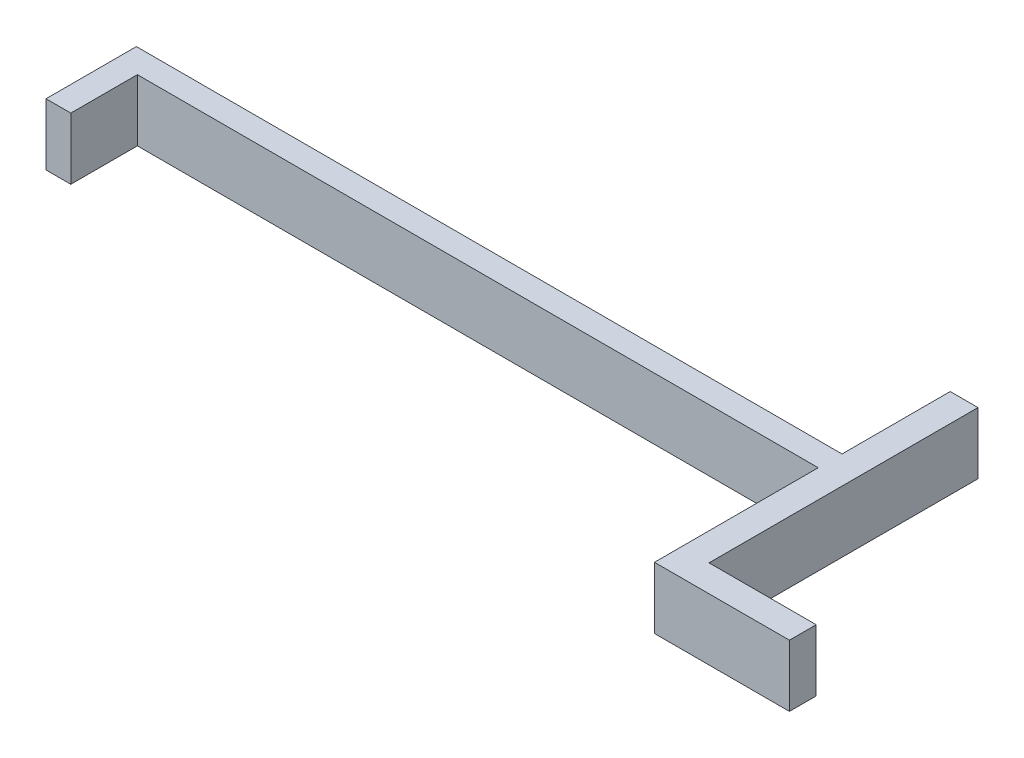
ISO-10303-21;
HEADER;
FILE_DESCRIPTION(('STEP AP214'),'2;1');
FILE_NAME('part.step','',(''),(''),'','','');
FILE_SCHEMA(('AUTOMOTIVE_DESIGN { 1 0 10303 214 1 1 1 1 }'));
ENDSEC;
DATA;
#1=APPLICATION_CONTEXT('core data for automotive mechanical design processes');
#2=APPLICATION_PROTOCOL_DEFINITION('international standard','automotive_design',2000,#1);
#3=PRODUCT_CONTEXT('',#1,'mechanical');
#4=PRODUCT('Part','Part','',(#3));
#5=PRODUCT_RELATED_PRODUCT_CATEGORY('part','',(#4));
#6=PRODUCT_DEFINITION_FORMATION('','',#4);
#7=PRODUCT_DEFINITION_CONTEXT('part definition',#1,'design');
#8=PRODUCT_DEFINITION('design','',#6,#7);
#9=PRODUCT_DEFINITION_SHAPE('','',#8);
#10=(LENGTH_UNIT() NAMED_UNIT(*) SI_UNIT(.MILLI.,.METRE.));
#11=(NAMED_UNIT(*) PLANE_ANGLE_UNIT() SI_UNIT($,.RADIAN.));
#12=(NAMED_UNIT(*) SI_UNIT($,.STERADIAN.) SOLID_ANGLE_UNIT());
#13=UNCERTAINTY_MEASURE_WITH_UNIT(LENGTH_MEASURE(1.E-05),#10,'distance_accuracy_value','');
#14=(GEOMETRIC_REPRESENTATION_CONTEXT(3) GLOBAL_UNCERTAINTY_ASSIGNED_CONTEXT((#13)) GLOBAL_UNIT_ASSIGNED_CONTEXT((#10,
#11,#12)) REPRESENTATION_CONTEXT('',''));
#15=CARTESIAN_POINT('',(0.,0.,0.));
#16=DIRECTION('',(0.,0.,1.));
#17=DIRECTION('',(1.,0.,0.));
#18=AXIS2_PLACEMENT_3D('',#15,#16,#17);
#19=CARTESIAN_POINT('',(20.8309313433102,1.,-21.4612157543274));
#20=DIRECTION('',(0.,0.,1.));
#21=DIRECTION('',(1.,0.,0.));
#22=AXIS2_PLACEMENT_3D('',#19,#20,#21);
#23=PLANE('',#22);
#24=DIRECTION('',(-1.,0.,0.));
#25=VECTOR('',#24,1.);
#26=CARTESIAN_POINT('',(20.8309313433102,0.,-21.4612157543274));
#27=LINE('',#26,#25);
#28=CARTESIAN_POINT('',(20.8309313433102,0.,-21.4612157543274));
#29=VERTEX_POINT('',#28);
#30=CARTESIAN_POINT('',(19.0932787643566,0.,-21.4612157543274));
#31=VERTEX_POINT('',#30);
#32=EDGE_CURVE('E11',#29,#31,#27,.T.);
#33=ORIENTED_EDGE('',*,*,#32,.T.);
#34=DIRECTION('',(0.,-1.,0.));
#35=VECTOR('',#34,1.);
#36=CARTESIAN_POINT('',(19.0932787643566,1.,-21.4612157543274));
#37=LINE('',#36,#35);
#38=CARTESIAN_POINT('',(19.0932787643566,1.,-21.4612157543274));
#39=VERTEX_POINT('',#38);
#40=EDGE_CURVE('E255',#39,#31,#37,.T.);
#41=ORIENTED_EDGE('',*,*,#40,.F.);
#42=DIRECTION('',(-1.,0.,0.));
#43=VECTOR('',#42,1.);
#44=CARTESIAN_POINT('',(20.8309313433102,1.,-21.4612157543274));
#45=LINE('',#44,#43);
#46=CARTESIAN_POINT('',(20.8309313433102,1.,-21.4612157543274));
#47=VERTEX_POINT('',#46);
#48=EDGE_CURVE('E43',#47,#39,#45,.T.);
#49=ORIENTED_EDGE('',*,*,#48,.F.);
#50=DIRECTION('',(0.,-1.,0.));
#51=VECTOR('',#50,1.);
#52=CARTESIAN_POINT('',(20.8309313433102,1.,-21.4612157543274));
#53=LINE('',#52,#51);
#54=EDGE_CURVE('E167',#47,#29,#53,.T.);
#55=ORIENTED_EDGE('',*,*,#54,.T.);
#56=EDGE_LOOP('',(#33,#41,#49,#55));
#57=FACE_BOUND('',#56,.T.);
#58=ADVANCED_FACE('F39',(#57),#23,.F.);
#59=CARTESIAN_POINT('',(19.0932787643566,1.,-21.4612157543274));
#60=DIRECTION('',(-1.,0.,0.));
#61=DIRECTION('',(0.,0.,1.));
#62=AXIS2_PLACEMENT_3D('',#59,#60,#61);
#63=PLANE('',#62);
#64=DIRECTION('',(0.,0.,-1.));
#65=VECTOR('',#64,1.);
#66=CARTESIAN_POINT('',(19.0932787643566,0.,-21.4612157543274));
#67=LINE('',#66,#65);
#68=CARTESIAN_POINT('',(19.0932787643567,0.,-25.8214365774423));
#69=VERTEX_POINT('',#68);
#70=EDGE_CURVE('E49',#31,#69,#67,.T.);
#71=ORIENTED_EDGE('',*,*,#70,.T.);
#72=DIRECTION('',(0.,-1.,0.));
#73=VECTOR('',#72,1.);
#74=CARTESIAN_POINT('',(19.0932787643567,1.,-25.8214365774423));
#75=LINE('',#74,#73);
#76=CARTESIAN_POINT('',(19.0932787643567,1.,-25.8214365774423));
#77=VERTEX_POINT('',#76);
#78=EDGE_CURVE('E143',#77,#69,#75,.T.);
#79=ORIENTED_EDGE('',*,*,#78,.F.);
#80=DIRECTION('',(0.,0.,-1.));
#81=VECTOR('',#80,1.);
#82=CARTESIAN_POINT('',(19.0932787643566,1.,-21.4612157543274));
#83=LINE('',#82,#81);
#84=EDGE_CURVE('E97',#39,#77,#83,.T.);
#85=ORIENTED_EDGE('',*,*,#84,.F.);
#86=ORIENTED_EDGE('',*,*,#40,.T.);
#87=EDGE_LOOP('',(#71,#79,#85,#86));
#88=FACE_BOUND('',#87,.T.);
#89=ADVANCED_FACE('F256',(#88),#63,.F.);
#90=CARTESIAN_POINT('',(19.0932787643567,1.,-25.8214365774423));
#91=DIRECTION('',(0.,0.,1.));
#92=DIRECTION('',(1.,0.,0.));
#93=AXIS2_PLACEMENT_3D('',#90,#91,#92);
#94=PLANE('',#93);
#95=DIRECTION('',(-1.,0.,0.));
#96=VECTOR('',#95,1.);
#97=CARTESIAN_POINT('',(19.0932787643567,0.,-25.8214365774423));
#98=LINE('',#97,#96);
#99=CARTESIAN_POINT('',(18.6427762438872,0.,-25.8214365774423));
#100=VERTEX_POINT('',#99);
#101=EDGE_CURVE('E137',#69,#100,#98,.T.);
#102=ORIENTED_EDGE('',*,*,#101,.T.);
#103=DIRECTION('',(0.,-1.,0.));
#104=VECTOR('',#103,1.);
#105=CARTESIAN_POINT('',(18.6427762438872,1.,-25.8214365774423));
#106=LINE('',#105,#104);
#107=CARTESIAN_POINT('',(18.6427762438872,1.,-25.8214365774423));
#108=VERTEX_POINT('',#107);
#109=EDGE_CURVE('E141',#108,#100,#106,.T.);
#110=ORIENTED_EDGE('',*,*,#109,.F.);
#111=DIRECTION('',(-1.,0.,0.));
#112=VECTOR('',#111,1.);
#113=CARTESIAN_POINT('',(19.0932787643567,1.,-25.8214365774423));
#114=LINE('',#113,#112);
#115=EDGE_CURVE('E182',#77,#108,#114,.T.);
#116=ORIENTED_EDGE('',*,*,#115,.F.);
#117=ORIENTED_EDGE('',*,*,#78,.T.);
#118=EDGE_LOOP('',(#102,#110,#116,#117));
#119=FACE_BOUND('',#118,.T.);
#120=ADVANCED_FACE('F139',(#119),#94,.F.);
#121=CARTESIAN_POINT('',(18.6427762438872,1.,-25.8214365774423));
#122=DIRECTION('',(1.,0.,0.));
#123=DIRECTION('',(0.,0.,-1.));
#124=AXIS2_PLACEMENT_3D('',#121,#122,#123);
#125=PLANE('',#124);
#126=DIRECTION('',(0.,0.,1.));
#127=VECTOR('',#126,1.);
#128=CARTESIAN_POINT('',(18.6427762438872,0.,-25.8214365774423));
#129=LINE('',#128,#127);
#130=CARTESIAN_POINT('',(18.6427762438872,0.,-24.0676946227577));
#131=VERTEX_POINT('',#130);
#132=EDGE_CURVE('E145',#100,#131,#129,.T.);
#133=ORIENTED_EDGE('',*,*,#132,.T.);
#134=DIRECTION('',(0.,-1.,0.));
#135=VECTOR('',#134,1.);
#136=CARTESIAN_POINT('',(18.6427762438872,1.,-24.0676946227577));
#137=LINE('',#136,#135);
#138=CARTESIAN_POINT('',(18.6427762438872,1.,-24.0676946227577));
#139=VERTEX_POINT('',#138);
#140=EDGE_CURVE('E152',#139,#131,#137,.T.);
#141=ORIENTED_EDGE('',*,*,#140,.F.);
#142=DIRECTION('',(0.,0.,1.));
#143=VECTOR('',#142,1.);
#144=CARTESIAN_POINT('',(18.6427762438872,1.,-25.8214365774423));
#145=LINE('',#144,#143);
#146=EDGE_CURVE('E151',#108,#139,#145,.T.);
#147=ORIENTED_EDGE('',*,*,#146,.F.);
#148=ORIENTED_EDGE('',*,*,#109,.T.);
#149=EDGE_LOOP('',(#133,#141,#147,#148));
#150=FACE_BOUND('',#149,.T.);
#151=ADVANCED_FACE('F148',(#150),#125,.F.);
#152=CARTESIAN_POINT('',(18.6427762438872,1.,-24.0676946227577));
#153=DIRECTION('',(0.,0.,1.));
#154=DIRECTION('',(1.,0.,0.));
#155=AXIS2_PLACEMENT_3D('',#152,#153,#154);
#156=PLANE('',#155);
#157=DIRECTION('',(-1.,0.,0.));
#158=VECTOR('',#157,1.);
#159=CARTESIAN_POINT('',(18.6427762438872,0.,-24.0676946227577));
#160=LINE('',#159,#158);
#161=CARTESIAN_POINT('',(7.20323009910986,0.,-24.0676946227577));
#162=VERTEX_POINT('',#161);
#163=EDGE_CURVE('E157',#131,#162,#160,.T.);
#164=ORIENTED_EDGE('',*,*,#163,.T.);
#165=DIRECTION('',(0.,-1.,0.));
#166=VECTOR('',#165,1.);
#167=CARTESIAN_POINT('',(7.20323009910986,1.,-24.0676946227577));
#168=LINE('',#167,#166);
#169=CARTESIAN_POINT('',(7.20323009910986,1.,-24.0676946227577));
#170=VERTEX_POINT('',#169);
#171=EDGE_CURVE('E207',#170,#162,#168,.T.);
#172=ORIENTED_EDGE('',*,*,#171,.F.);
#173=DIRECTION('',(-1.,0.,0.));
#174=VECTOR('',#173,1.);
#175=CARTESIAN_POINT('',(18.6427762438872,1.,-24.0676946227577));
#176=LINE('',#175,#174);
#177=EDGE_CURVE('E179',#139,#170,#176,.T.);
#178=ORIENTED_EDGE('',*,*,#177,.F.);
#179=ORIENTED_EDGE('',*,*,#140,.T.);
#180=EDGE_LOOP('',(#164,#172,#178,#179));
#181=FACE_BOUND('',#180,.T.);
#182=ADVANCED_FACE('F250',(#181),#156,.F.);
#183=CARTESIAN_POINT('',(7.20323009910986,1.,-24.0676946227577));
#184=DIRECTION('',(1.,0.,0.));
#185=DIRECTION('',(0.,0.,-1.));
#186=AXIS2_PLACEMENT_3D('',#183,#184,#185);
#187=PLANE('',#186);
#188=DIRECTION('',(0.,0.,1.));
#189=VECTOR('',#188,1.);
#190=CARTESIAN_POINT('',(7.20323009910986,0.,-24.0676946227577));
#191=LINE('',#190,#189);
#192=CARTESIAN_POINT('',(7.20323009910986,0.,-22.6024558999234));
#193=VERTEX_POINT('',#192);
#194=EDGE_CURVE('E159',#162,#193,#191,.T.);
#195=ORIENTED_EDGE('',*,*,#194,.T.);
#196=DIRECTION('',(0.,-1.,0.));
#197=VECTOR('',#196,1.);
#198=CARTESIAN_POINT('',(7.20323009910986,1.,-22.6024558999234));
#199=LINE('',#198,#197);
#200=CARTESIAN_POINT('',(7.20323009910986,1.,-22.6024558999234));
#201=VERTEX_POINT('',#200);
#202=EDGE_CURVE('E204',#201,#193,#199,.T.);
#203=ORIENTED_EDGE('',*,*,#202,.F.);
#204=DIRECTION('',(0.,0.,1.));
#205=VECTOR('',#204,1.);
#206=CARTESIAN_POINT('',(7.20323009910986,1.,-24.0676946227577));
#207=LINE('',#206,#205);
#208=EDGE_CURVE('E177',#170,#201,#207,.T.);
#209=ORIENTED_EDGE('',*,*,#208,.F.);
#210=ORIENTED_EDGE('',*,*,#171,.T.);
#211=EDGE_LOOP('',(#195,#203,#209,#210));
#212=FACE_BOUND('',#211,.T.);
#213=ADVANCED_FACE('F202',(#212),#187,.F.);
#214=CARTESIAN_POINT('',(7.20323009910986,1.,-22.6024558999234));
#215=DIRECTION('',(0.,0.,-1.));
#216=DIRECTION('',(-1.,0.,0.));
#217=AXIS2_PLACEMENT_3D('',#214,#215,#216);
#218=PLANE('',#217);
#219=DIRECTION('',(1.,0.,0.));
#220=VECTOR('',#219,1.);
#221=CARTESIAN_POINT('',(7.20323009910986,0.,-22.6024558999234));
#222=LINE('',#221,#220);
#223=CARTESIAN_POINT('',(7.60546449238613,0.,-22.6024558999234));
#224=VERTEX_POINT('',#223);
#225=EDGE_CURVE('E197',#193,#224,#222,.T.);
#226=ORIENTED_EDGE('',*,*,#225,.T.);
#227=DIRECTION('',(0.,-1.,0.));
#228=VECTOR('',#227,1.);
#229=CARTESIAN_POINT('',(7.60546449238613,1.,-22.6024558999234));
#230=LINE('',#229,#228);
#231=CARTESIAN_POINT('',(7.60546449238613,1.,-22.6024558999234));
#232=VERTEX_POINT('',#231);
#233=EDGE_CURVE('E213',#232,#224,#230,.T.);
#234=ORIENTED_EDGE('',*,*,#233,.F.);
#235=DIRECTION('',(1.,0.,0.));
#236=VECTOR('',#235,1.);
#237=CARTESIAN_POINT('',(7.20323009910986,1.,-22.6024558999234));
#238=LINE('',#237,#236);
#239=EDGE_CURVE('E175',#201,#232,#238,.T.);
#240=ORIENTED_EDGE('',*,*,#239,.F.);
#241=ORIENTED_EDGE('',*,*,#202,.T.);
#242=EDGE_LOOP('',(#226,#234,#240,#241));
#243=FACE_BOUND('',#242,.T.);
#244=ADVANCED_FACE('F210',(#243),#218,.F.);
#245=CARTESIAN_POINT('',(7.60546449238613,1.,-22.6024558999234));
#246=DIRECTION('',(-1.,0.,0.));
#247=DIRECTION('',(0.,0.,1.));
#248=AXIS2_PLACEMENT_3D('',#245,#246,#247);
#249=PLANE('',#248);
#250=DIRECTION('',(0.,0.,-1.));
#251=VECTOR('',#250,1.);
#252=CARTESIAN_POINT('',(7.60546449238613,0.,-22.6024558999234));
#253=LINE('',#252,#251);
#254=CARTESIAN_POINT('',(7.60546449238613,0.,-23.6815496052125));
#255=VERTEX_POINT('',#254);
#256=EDGE_CURVE('E195',#224,#255,#253,.T.);
#257=ORIENTED_EDGE('',*,*,#256,.T.);
#258=DIRECTION('',(0.,-1.,0.));
#259=VECTOR('',#258,1.);
#260=CARTESIAN_POINT('',(7.60546449238613,1.,-23.6815496052125));
#261=LINE('',#260,#259);
#262=CARTESIAN_POINT('',(7.60546449238613,1.,-23.6815496052125));
#263=VERTEX_POINT('',#262);
#264=EDGE_CURVE('E223',#263,#255,#261,.T.);
#265=ORIENTED_EDGE('',*,*,#264,.F.);
#266=DIRECTION('',(0.,0.,-1.));
#267=VECTOR('',#266,1.);
#268=CARTESIAN_POINT('',(7.60546449238613,1.,-22.6024558999234));
#269=LINE('',#268,#267);
#270=EDGE_CURVE('E173',#232,#263,#269,.T.);
#271=ORIENTED_EDGE('',*,*,#270,.F.);
#272=ORIENTED_EDGE('',*,*,#233,.T.);
#273=EDGE_LOOP('',(#257,#265,#271,#272));
#274=FACE_BOUND('',#273,.T.);
#275=ADVANCED_FACE('F221',(#274),#249,.F.);
#276=CARTESIAN_POINT('',(7.60546449238613,1.,-23.6815496052125));
#277=DIRECTION('',(0.,0.,-1.));
#278=DIRECTION('',(-1.,0.,0.));
#279=AXIS2_PLACEMENT_3D('',#276,#277,#278);
#280=PLANE('',#279);
#281=DIRECTION('',(1.,0.,0.));
#282=VECTOR('',#281,1.);
#283=CARTESIAN_POINT('',(7.60546449238613,0.,-23.6815496052125));
#284=LINE('',#283,#282);
#285=CARTESIAN_POINT('',(18.6427762438872,0.,-23.6815496052125));
#286=VERTEX_POINT('',#285);
#287=EDGE_CURVE('E193',#255,#286,#284,.T.);
#288=ORIENTED_EDGE('',*,*,#287,.T.);
#289=DIRECTION('',(0.,-1.,0.));
#290=VECTOR('',#289,1.);
#291=CARTESIAN_POINT('',(18.6427762438872,1.,-23.6815496052125));
#292=LINE('',#291,#290);
#293=CARTESIAN_POINT('',(18.6427762438872,1.,-23.6815496052125));
#294=VERTEX_POINT('',#293);
#295=EDGE_CURVE('E229',#294,#286,#292,.T.);
#296=ORIENTED_EDGE('',*,*,#295,.F.);
#297=DIRECTION('',(1.,0.,0.));
#298=VECTOR('',#297,1.);
#299=CARTESIAN_POINT('',(7.60546449238613,1.,-23.6815496052125));
#300=LINE('',#299,#298);
#301=EDGE_CURVE('E171',#263,#294,#300,.T.);
#302=ORIENTED_EDGE('',*,*,#301,.F.);
#303=ORIENTED_EDGE('',*,*,#264,.T.);
#304=EDGE_LOOP('',(#288,#296,#302,#303));
#305=FACE_BOUND('',#304,.T.);
#306=ADVANCED_FACE('F226',(#305),#280,.F.);
#307=CARTESIAN_POINT('',(18.6427762438872,1.,-23.6815496052125));
#308=DIRECTION('',(1.,0.,0.));
#309=DIRECTION('',(0.,0.,-1.));
#310=AXIS2_PLACEMENT_3D('',#307,#308,#309);
#311=PLANE('',#310);
#312=DIRECTION('',(0.,0.,1.));
#313=VECTOR('',#312,1.);
#314=CARTESIAN_POINT('',(18.6427762438872,0.,-23.6815496052125));
#315=LINE('',#314,#313);
#316=CARTESIAN_POINT('',(18.6427762438872,0.,-21.026802609589));
#317=VERTEX_POINT('',#316);
#318=EDGE_CURVE('E187',#286,#317,#315,.T.);
#319=ORIENTED_EDGE('',*,*,#318,.T.);
#320=DIRECTION('',(0.,-1.,0.));
#321=VECTOR('',#320,1.);
#322=CARTESIAN_POINT('',(18.6427762438872,1.,-21.026802609589));
#323=LINE('',#322,#321);
#324=CARTESIAN_POINT('',(18.6427762438872,1.,-21.026802609589));
#325=VERTEX_POINT('',#324);
#326=EDGE_CURVE('E231',#325,#317,#323,.T.);
#327=ORIENTED_EDGE('',*,*,#326,.F.);
#328=DIRECTION('',(0.,0.,1.));
#329=VECTOR('',#328,1.);
#330=CARTESIAN_POINT('',(18.6427762438872,1.,-23.6815496052125));
#331=LINE('',#330,#329);
#332=EDGE_CURVE('E169',#294,#325,#331,.T.);
#333=ORIENTED_EDGE('',*,*,#332,.F.);
#334=ORIENTED_EDGE('',*,*,#295,.T.);
#335=EDGE_LOOP('',(#319,#327,#333,#334));
#336=FACE_BOUND('',#335,.T.);
#337=ADVANCED_FACE('F247',(#336),#311,.F.);
#338=CARTESIAN_POINT('',(18.6427762438872,1.,-21.026802609589));
#339=DIRECTION('',(0.,0.,-1.));
#340=DIRECTION('',(-1.,0.,0.));
#341=AXIS2_PLACEMENT_3D('',#338,#339,#340);
#342=PLANE('',#341);
#343=DIRECTION('',(1.,0.,0.));
#344=VECTOR('',#343,1.);
#345=CARTESIAN_POINT('',(18.6427762438872,0.,-21.026802609589));
#346=LINE('',#345,#344);
#347=CARTESIAN_POINT('',(20.8309313433102,0.,-21.026802609589));
#348=VERTEX_POINT('',#347);
#349=EDGE_CURVE('E185',#317,#348,#346,.T.);
#350=ORIENTED_EDGE('',*,*,#349,.T.);
#351=DIRECTION('',(0.,-1.,0.));
#352=VECTOR('',#351,1.);
#353=CARTESIAN_POINT('',(20.8309313433102,1.,-21.026802609589));
#354=LINE('',#353,#352);
#355=CARTESIAN_POINT('',(20.8309313433102,1.,-21.026802609589));
#356=VERTEX_POINT('',#355);
#357=EDGE_CURVE('E236',#356,#348,#354,.T.);
#358=ORIENTED_EDGE('',*,*,#357,.F.);
#359=DIRECTION('',(1.,0.,0.));
#360=VECTOR('',#359,1.);
#361=CARTESIAN_POINT('',(18.6427762438872,1.,-21.026802609589));
#362=LINE('',#361,#360);
#363=EDGE_CURVE('E166',#325,#356,#362,.T.);
#364=ORIENTED_EDGE('',*,*,#363,.F.);
#365=ORIENTED_EDGE('',*,*,#326,.T.);
#366=EDGE_LOOP('',(#350,#358,#364,#365));
#367=FACE_BOUND('',#366,.T.);
#368=ADVANCED_FACE('F242',(#367),#342,.F.);
#369=CARTESIAN_POINT('',(20.8309313433102,1.,-21.026802609589));
#370=DIRECTION('',(-1.,0.,0.));
#371=DIRECTION('',(0.,0.,1.));
#372=AXIS2_PLACEMENT_3D('',#369,#370,#371);
#373=PLANE('',#372);
#374=DIRECTION('',(0.,0.,-1.));
#375=VECTOR('',#374,1.);
#376=CARTESIAN_POINT('',(20.8309313433102,0.,-21.026802609589));
#377=LINE('',#376,#375);
#378=EDGE_CURVE('E108',#348,#29,#377,.T.);
#379=ORIENTED_EDGE('',*,*,#378,.T.);
#380=ORIENTED_EDGE('',*,*,#54,.F.);
#381=DIRECTION('',(0.,0.,-1.));
#382=VECTOR('',#381,1.);
#383=CARTESIAN_POINT('',(20.8309313433102,1.,-21.026802609589));
#384=LINE('',#383,#382);
#385=EDGE_CURVE('E164',#356,#47,#384,.T.);
#386=ORIENTED_EDGE('',*,*,#385,.F.);
#387=ORIENTED_EDGE('',*,*,#357,.T.);
#388=EDGE_LOOP('',(#379,#380,#386,#387));
#389=FACE_BOUND('',#388,.T.);
#390=ADVANCED_FACE('F283',(#389),#373,.F.);
#391=CARTESIAN_POINT('',(0.,1.,0.));
#392=DIRECTION('',(0.,-1.,0.));
#393=DIRECTION('',(0.,0.,-1.));
#394=AXIS2_PLACEMENT_3D('',#391,#392,#393);
#395=PLANE('',#394);
#396=ORIENTED_EDGE('',*,*,#48,.T.);
#397=ORIENTED_EDGE('',*,*,#84,.T.);
#398=ORIENTED_EDGE('',*,*,#115,.T.);
#399=ORIENTED_EDGE('',*,*,#146,.T.);
#400=ORIENTED_EDGE('',*,*,#177,.T.);
#401=ORIENTED_EDGE('',*,*,#208,.T.);
#402=ORIENTED_EDGE('',*,*,#239,.T.);
#403=ORIENTED_EDGE('',*,*,#270,.T.);
#404=ORIENTED_EDGE('',*,*,#301,.T.);
#405=ORIENTED_EDGE('',*,*,#332,.T.);
#406=ORIENTED_EDGE('',*,*,#363,.T.);
#407=ORIENTED_EDGE('',*,*,#385,.T.);
#408=EDGE_LOOP('',(#396,#397,#398,#399,#400,#401,#402,#403,#404,#405,#406,#407));
#409=FACE_BOUND('',#408,.T.);
#410=ADVANCED_FACE('F41',(#409),#395,.F.);
#411=CARTESIAN_POINT('',(0.,0.,0.));
#412=DIRECTION('',(0.,-1.,0.));
#413=DIRECTION('',(0.,0.,-1.));
#414=AXIS2_PLACEMENT_3D('',#411,#412,#413);
#415=PLANE('',#414);
#416=ORIENTED_EDGE('',*,*,#32,.F.);
#417=ORIENTED_EDGE('',*,*,#378,.F.);
#418=ORIENTED_EDGE('',*,*,#349,.F.);
#419=ORIENTED_EDGE('',*,*,#318,.F.);
#420=ORIENTED_EDGE('',*,*,#287,.F.);
#421=ORIENTED_EDGE('',*,*,#256,.F.);
#422=ORIENTED_EDGE('',*,*,#225,.F.);
#423=ORIENTED_EDGE('',*,*,#194,.F.);
#424=ORIENTED_EDGE('',*,*,#163,.F.);
#425=ORIENTED_EDGE('',*,*,#132,.F.);
#426=ORIENTED_EDGE('',*,*,#101,.F.);
#427=ORIENTED_EDGE('',*,*,#70,.F.);
#428=EDGE_LOOP('',(#416,#417,#418,#419,#420,#421,#422,#423,#424,#425,#426,#427));
#429=FACE_BOUND('',#428,.T.);
#430=ADVANCED_FACE('F155',(#429),#415,.T.);
#431=CLOSED_SHELL('',(#58,#89,#120,#151,#182,#213,#244,#275,#306,#337,#368,#390,#410,#430));
#432=MANIFOLD_SOLID_BREP('B2',#431);
#433=ADVANCED_BREP_SHAPE_REPRESENTATION('',(#18,#432),#14);
#434=SHAPE_DEFINITION_REPRESENTATION(#9,#433);
ENDSEC;
END-ISO-10303-21;
